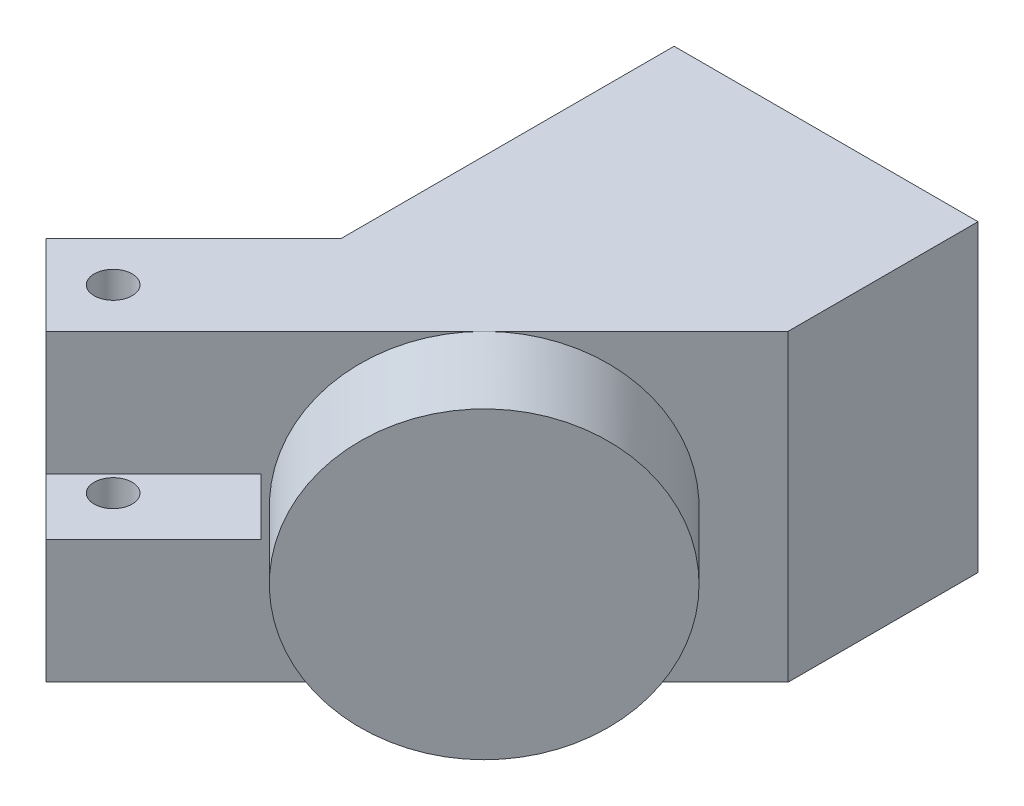
ISO-10303-21;
HEADER;
FILE_DESCRIPTION(('STEP AP214'),'2;1');
FILE_NAME('part.step','',(''),(''),'','','');
FILE_SCHEMA(('AUTOMOTIVE_DESIGN { 1 0 10303 214 1 1 1 1 }'));
ENDSEC;
DATA;
#1=APPLICATION_CONTEXT('core data for automotive mechanical design processes');
#2=APPLICATION_PROTOCOL_DEFINITION('international standard','automotive_design',2000,#1);
#3=PRODUCT_CONTEXT('',#1,'mechanical');
#4=PRODUCT('Part','Part','',(#3));
#5=PRODUCT_RELATED_PRODUCT_CATEGORY('part','',(#4));
#6=PRODUCT_DEFINITION_FORMATION('','',#4);
#7=PRODUCT_DEFINITION_CONTEXT('part definition',#1,'design');
#8=PRODUCT_DEFINITION('design','',#6,#7);
#9=PRODUCT_DEFINITION_SHAPE('','',#8);
#10=(LENGTH_UNIT() NAMED_UNIT(*) SI_UNIT(.MILLI.,.METRE.));
#11=(NAMED_UNIT(*) PLANE_ANGLE_UNIT() SI_UNIT($,.RADIAN.));
#12=(NAMED_UNIT(*) SI_UNIT($,.STERADIAN.) SOLID_ANGLE_UNIT());
#13=UNCERTAINTY_MEASURE_WITH_UNIT(LENGTH_MEASURE(1.E-05),#10,'distance_accuracy_value','');
#14=(GEOMETRIC_REPRESENTATION_CONTEXT(3) GLOBAL_UNCERTAINTY_ASSIGNED_CONTEXT((#13)) GLOBAL_UNIT_ASSIGNED_CONTEXT((#10,
#11,#12)) REPRESENTATION_CONTEXT('',''));
#15=CARTESIAN_POINT('',(0.,0.,0.));
#16=DIRECTION('',(0.,0.,1.));
#17=DIRECTION('',(1.,0.,0.));
#18=AXIS2_PLACEMENT_3D('',#15,#16,#17);
#19=CARTESIAN_POINT('',(-3.53553390593274,0.,29.5355339059327));
#20=DIRECTION('',(-0.707106781186547,0.,0.707106781186547));
#21=DIRECTION('',(0.707106781186548,0.,0.707106781186548));
#22=AXIS2_PLACEMENT_3D('',#19,#20,#21);
#23=PLANE('',#22);
#24=DIRECTION('',(0.707106781186547,0.,0.707106781186547));
#25=VECTOR('',#24,1.);
#26=CARTESIAN_POINT('',(-3.53553390593275,6.5,29.5355339059327));
#27=LINE('',#26,#25);
#28=CARTESIAN_POINT('',(-7.77817459305203,6.5,25.2928932188135));
#29=VERTEX_POINT('',#28);
#30=CARTESIAN_POINT('',(-3.53553390593275,6.5,29.5355339059327));
#31=VERTEX_POINT('',#30);
#32=EDGE_CURVE('E169',#29,#31,#27,.T.);
#33=ORIENTED_EDGE('',*,*,#32,.F.);
#34=DIRECTION('',(0.,1.,0.));
#35=VECTOR('',#34,1.);
#36=CARTESIAN_POINT('',(-7.77817459305202,0.,25.2928932188135));
#37=LINE('',#36,#35);
#38=CARTESIAN_POINT('',(-7.77817459305202,0.,25.2928932188135));
#39=VERTEX_POINT('',#38);
#40=EDGE_CURVE('E204',#39,#29,#37,.T.);
#41=ORIENTED_EDGE('',*,*,#40,.F.);
#42=DIRECTION('',(0.707106781186547,0.,0.707106781186547));
#43=VECTOR('',#42,1.);
#44=CARTESIAN_POINT('',(-3.53553390593274,0.,29.5355339059327));
#45=LINE('',#44,#43);
#46=CARTESIAN_POINT('',(-3.53553390593274,0.,29.5355339059327));
#47=VERTEX_POINT('',#46);
#48=EDGE_CURVE('E188',#39,#47,#45,.T.);
#49=ORIENTED_EDGE('',*,*,#48,.T.);
#50=DIRECTION('',(0.,1.,0.));
#51=VECTOR('',#50,1.);
#52=CARTESIAN_POINT('',(-3.53553390593274,0.,29.5355339059327));
#53=LINE('',#52,#51);
#54=EDGE_CURVE('E200',#47,#31,#53,.T.);
#55=ORIENTED_EDGE('',*,*,#54,.T.);
#56=EDGE_LOOP('',(#33,#41,#49,#55));
#57=FACE_BOUND('',#56,.T.);
#58=ADVANCED_FACE('F41',(#57),#23,.T.);
#59=CARTESIAN_POINT('',(0.,16.,26.));
#60=DIRECTION('',(0.707106781186548,0.,0.707106781186548));
#61=DIRECTION('',(0.707106781186548,0.,-0.707106781186548));
#62=AXIS2_PLACEMENT_3D('',#59,#60,#61);
#63=PLANE('',#62);
#64=DIRECTION('',(-0.707106781186548,0.,0.707106781186547));
#65=VECTOR('',#64,1.);
#66=CARTESIAN_POINT('',(2.12132034355963,6.5,23.8786796564404));
#67=LINE('',#66,#65);
#68=CARTESIAN_POINT('',(2.12132034355963,6.5,23.8786796564404));
#69=VERTEX_POINT('',#68);
#70=EDGE_CURVE('E196',#69,#31,#67,.T.);
#71=ORIENTED_EDGE('',*,*,#70,.T.);
#72=ORIENTED_EDGE('',*,*,#54,.F.);
#73=DIRECTION('',(-0.707106781186548,0.,0.707106781186548));
#74=VECTOR('',#73,1.);
#75=CARTESIAN_POINT('',(0.,0.,26.));
#76=LINE('',#75,#74);
#77=CARTESIAN_POINT('',(8.00000000000001,0.,18.));
#78=VERTEX_POINT('',#77);
#79=EDGE_CURVE('E214',#78,#47,#76,.T.);
#80=ORIENTED_EDGE('',*,*,#79,.F.);
#81=CARTESIAN_POINT('',(8.00000000000001,8.,18.));
#82=DIRECTION('',(0.707106781186548,0.,0.707106781186547));
#83=DIRECTION('',(0.707106781186547,0.,-0.707106781186548));
#84=AXIS2_PLACEMENT_3D('',#81,#82,#83);
#85=CIRCLE('',#84,8.);
#86=CARTESIAN_POINT('',(8.00000000000001,16.,18.));
#87=VERTEX_POINT('',#86);
#88=EDGE_CURVE('E53',#87,#78,#85,.T.);
#89=ORIENTED_EDGE('',*,*,#88,.F.);
#90=DIRECTION('',(-0.707106781186548,0.,0.707106781186548));
#91=VECTOR('',#90,1.);
#92=CARTESIAN_POINT('',(0.,16.,26.));
#93=LINE('',#92,#91);
#94=CARTESIAN_POINT('',(-3.53553390593274,16.,29.5355339059327));
#95=VERTEX_POINT('',#94);
#96=EDGE_CURVE('E222',#87,#95,#93,.T.);
#97=ORIENTED_EDGE('',*,*,#96,.T.);
#98=CARTESIAN_POINT('',(-3.53553390593275,9.5,29.5355339059327));
#99=VERTEX_POINT('',#98);
#100=EDGE_CURVE('E174',#99,#95,#53,.T.);
#101=ORIENTED_EDGE('',*,*,#100,.F.);
#102=DIRECTION('',(-0.707106781186548,0.,0.707106781186547));
#103=VECTOR('',#102,1.);
#104=CARTESIAN_POINT('',(2.12132034355963,9.5,23.8786796564404));
#105=LINE('',#104,#103);
#106=CARTESIAN_POINT('',(2.12132034355963,9.5,23.8786796564404));
#107=VERTEX_POINT('',#106);
#108=EDGE_CURVE('E152',#107,#99,#105,.T.);
#109=ORIENTED_EDGE('',*,*,#108,.F.);
#110=DIRECTION('',(0.,1.,0.));
#111=VECTOR('',#110,1.);
#112=CARTESIAN_POINT('',(2.12132034355963,9.5,23.8786796564404));
#113=LINE('',#112,#111);
#114=EDGE_CURVE('E159',#69,#107,#113,.T.);
#115=ORIENTED_EDGE('',*,*,#114,.F.);
#116=EDGE_LOOP('',(#71,#72,#80,#89,#97,#101,#109,#115));
#117=FACE_BOUND('',#116,.T.);
#118=ADVANCED_FACE('F172',(#117),#63,.T.);
#119=CARTESIAN_POINT('',(0.,0.,0.));
#120=DIRECTION('',(0.,0.,-1.));
#121=DIRECTION('',(-1.,0.,0.));
#122=AXIS2_PLACEMENT_3D('',#119,#120,#121);
#123=PLANE('',#122);
#124=DIRECTION('',(0.,-1.,0.));
#125=VECTOR('',#124,1.);
#126=CARTESIAN_POINT('',(0.,0.,0.));
#127=LINE('',#126,#125);
#128=CARTESIAN_POINT('',(0.,16.,0.));
#129=VERTEX_POINT('',#128);
#130=CARTESIAN_POINT('',(0.,0.,0.));
#131=VERTEX_POINT('',#130);
#132=EDGE_CURVE('E272',#129,#131,#127,.T.);
#133=ORIENTED_EDGE('',*,*,#132,.F.);
#134=DIRECTION('',(-1.,0.,0.));
#135=VECTOR('',#134,1.);
#136=CARTESIAN_POINT('',(0.,16.,0.));
#137=LINE('',#136,#135);
#138=CARTESIAN_POINT('',(16.,16.,0.));
#139=VERTEX_POINT('',#138);
#140=EDGE_CURVE('E278',#139,#129,#137,.T.);
#141=ORIENTED_EDGE('',*,*,#140,.F.);
#142=DIRECTION('',(0.,1.,0.));
#143=VECTOR('',#142,1.);
#144=CARTESIAN_POINT('',(16.,0.,0.));
#145=LINE('',#144,#143);
#146=CARTESIAN_POINT('',(16.,0.,0.));
#147=VERTEX_POINT('',#146);
#148=EDGE_CURVE('E285',#147,#139,#145,.T.);
#149=ORIENTED_EDGE('',*,*,#148,.F.);
#150=DIRECTION('',(1.,0.,0.));
#151=VECTOR('',#150,1.);
#152=CARTESIAN_POINT('',(0.,0.,0.));
#153=LINE('',#152,#151);
#154=EDGE_CURVE('E282',#131,#147,#153,.T.);
#155=ORIENTED_EDGE('',*,*,#154,.F.);
#156=EDGE_LOOP('',(#133,#141,#149,#155));
#157=FACE_BOUND('',#156,.T.);
#158=DIRECTION('',(-1.,0.,0.));
#159=VECTOR('',#158,1.);
#160=CARTESIAN_POINT('',(3.,13.,0.));
#161=LINE('',#160,#159);
#162=CARTESIAN_POINT('',(13.,13.,0.));
#163=VERTEX_POINT('',#162);
#164=CARTESIAN_POINT('',(3.,13.,0.));
#165=VERTEX_POINT('',#164);
#166=EDGE_CURVE('E232',#163,#165,#161,.T.);
#167=ORIENTED_EDGE('',*,*,#166,.T.);
#168=DIRECTION('',(0.,-1.,0.));
#169=VECTOR('',#168,1.);
#170=CARTESIAN_POINT('',(3.,3.,0.));
#171=LINE('',#170,#169);
#172=CARTESIAN_POINT('',(3.,3.,0.));
#173=VERTEX_POINT('',#172);
#174=EDGE_CURVE('E221',#165,#173,#171,.T.);
#175=ORIENTED_EDGE('',*,*,#174,.T.);
#176=DIRECTION('',(1.,0.,0.));
#177=VECTOR('',#176,1.);
#178=CARTESIAN_POINT('',(3.,3.,0.));
#179=LINE('',#178,#177);
#180=CARTESIAN_POINT('',(13.,3.,0.));
#181=VERTEX_POINT('',#180);
#182=EDGE_CURVE('E248',#173,#181,#179,.T.);
#183=ORIENTED_EDGE('',*,*,#182,.T.);
#184=DIRECTION('',(0.,1.,0.));
#185=VECTOR('',#184,1.);
#186=CARTESIAN_POINT('',(13.,3.,0.));
#187=LINE('',#186,#185);
#188=EDGE_CURVE('E252',#181,#163,#187,.T.);
#189=ORIENTED_EDGE('',*,*,#188,.T.);
#190=EDGE_LOOP('',(#167,#175,#183,#189));
#191=FACE_BOUND('',#190,.T.);
#192=ADVANCED_FACE('F311',(#157,#191),#123,.T.);
#193=CARTESIAN_POINT('',(0.,0.,10.));
#194=DIRECTION('',(1.,0.,0.));
#195=DIRECTION('',(0.,0.,-1.));
#196=AXIS2_PLACEMENT_3D('',#193,#194,#195);
#197=PLANE('',#196);
#198=DIRECTION('',(0.,0.,-1.));
#199=VECTOR('',#198,1.);
#200=CARTESIAN_POINT('',(0.,0.,10.));
#201=LINE('',#200,#199);
#202=CARTESIAN_POINT('',(0.,0.,17.5147186257614));
#203=VERTEX_POINT('',#202);
#204=EDGE_CURVE('E51',#203,#131,#201,.T.);
#205=ORIENTED_EDGE('',*,*,#204,.F.);
#206=DIRECTION('',(0.,1.,0.));
#207=VECTOR('',#206,1.);
#208=CARTESIAN_POINT('',(0.,0.,17.5147186257614));
#209=LINE('',#208,#207);
#210=CARTESIAN_POINT('',(0.,16.,17.5147186257614));
#211=VERTEX_POINT('',#210);
#212=EDGE_CURVE('E193',#203,#211,#209,.T.);
#213=ORIENTED_EDGE('',*,*,#212,.T.);
#214=DIRECTION('',(0.,0.,-1.));
#215=VECTOR('',#214,1.);
#216=CARTESIAN_POINT('',(0.,16.,10.));
#217=LINE('',#216,#215);
#218=EDGE_CURVE('E277',#211,#129,#217,.T.);
#219=ORIENTED_EDGE('',*,*,#218,.T.);
#220=ORIENTED_EDGE('',*,*,#132,.T.);
#221=EDGE_LOOP('',(#205,#213,#219,#220));
#222=FACE_BOUND('',#221,.T.);
#223=ADVANCED_FACE('F43',(#222),#197,.F.);
#224=CARTESIAN_POINT('',(0.,0.,10.));
#225=DIRECTION('',(0.,1.,0.));
#226=DIRECTION('',(0.,0.,1.));
#227=AXIS2_PLACEMENT_3D('',#224,#225,#226);
#228=PLANE('',#227);
#229=CARTESIAN_POINT('',(-3.88908729652601,0.,25.6464466094067));
#230=DIRECTION('',(0.,1.,0.));
#231=DIRECTION('',(0.,0.,1.));
#232=AXIS2_PLACEMENT_3D('',#229,#230,#231);
#233=CIRCLE('',#232,1.);
#234=CARTESIAN_POINT('',(-3.88908729652601,0.,26.6464466094067));
#235=VERTEX_POINT('',#234);
#236=EDGE_CURVE('E356',#235,#235,#233,.T.);
#237=ORIENTED_EDGE('',*,*,#236,.T.);
#238=EDGE_LOOP('',(#237));
#239=FACE_BOUND('',#238,.T.);
#240=ORIENTED_EDGE('',*,*,#154,.T.);
#241=DIRECTION('',(0.,0.,-1.));
#242=VECTOR('',#241,1.);
#243=CARTESIAN_POINT('',(16.,0.,10.));
#244=LINE('',#243,#242);
#245=CARTESIAN_POINT('',(16.,0.,10.));
#246=VERTEX_POINT('',#245);
#247=EDGE_CURVE('E297',#246,#147,#244,.T.);
#248=ORIENTED_EDGE('',*,*,#247,.F.);
#249=EDGE_CURVE('E223',#246,#78,#76,.T.);
#250=ORIENTED_EDGE('',*,*,#249,.T.);
#251=ORIENTED_EDGE('',*,*,#79,.T.);
#252=ORIENTED_EDGE('',*,*,#48,.F.);
#253=DIRECTION('',(-0.707106781186548,0.,0.707106781186548));
#254=VECTOR('',#253,1.);
#255=CARTESIAN_POINT('',(-7.77817459305202,0.,25.2928932188135));
#256=LINE('',#255,#254);
#257=EDGE_CURVE('E184',#203,#39,#256,.T.);
#258=ORIENTED_EDGE('',*,*,#257,.F.);
#259=ORIENTED_EDGE('',*,*,#204,.T.);
#260=EDGE_LOOP('',(#240,#248,#250,#251,#252,#258,#259));
#261=FACE_BOUND('',#260,.T.);
#262=ADVANCED_FACE('F305',(#239,#261),#228,.F.);
#263=CARTESIAN_POINT('',(16.,0.,10.));
#264=DIRECTION('',(-1.,0.,0.));
#265=DIRECTION('',(0.,0.,1.));
#266=AXIS2_PLACEMENT_3D('',#263,#264,#265);
#267=PLANE('',#266);
#268=ORIENTED_EDGE('',*,*,#148,.T.);
#269=DIRECTION('',(0.,0.,-1.));
#270=VECTOR('',#269,1.);
#271=CARTESIAN_POINT('',(16.,16.,10.));
#272=LINE('',#271,#270);
#273=CARTESIAN_POINT('',(16.,16.,10.));
#274=VERTEX_POINT('',#273);
#275=EDGE_CURVE('E293',#274,#139,#272,.T.);
#276=ORIENTED_EDGE('',*,*,#275,.F.);
#277=DIRECTION('',(0.,1.,0.));
#278=VECTOR('',#277,1.);
#279=CARTESIAN_POINT('',(16.,0.,10.));
#280=LINE('',#279,#278);
#281=EDGE_CURVE('E273',#246,#274,#280,.T.);
#282=ORIENTED_EDGE('',*,*,#281,.F.);
#283=ORIENTED_EDGE('',*,*,#247,.T.);
#284=EDGE_LOOP('',(#268,#276,#282,#283));
#285=FACE_BOUND('',#284,.T.);
#286=ADVANCED_FACE('F321',(#285),#267,.F.);
#287=CARTESIAN_POINT('',(0.,16.,10.));
#288=DIRECTION('',(0.,-1.,0.));
#289=DIRECTION('',(0.,0.,-1.));
#290=AXIS2_PLACEMENT_3D('',#287,#288,#289);
#291=PLANE('',#290);
#292=CARTESIAN_POINT('',(-3.88908729652601,16.,25.6464466094067));
#293=DIRECTION('',(0.,1.,0.));
#294=DIRECTION('',(0.,0.,1.));
#295=AXIS2_PLACEMENT_3D('',#292,#293,#294);
#296=CIRCLE('',#295,1.);
#297=CARTESIAN_POINT('',(-3.88908729652601,16.,26.6464466094067));
#298=VERTEX_POINT('',#297);
#299=EDGE_CURVE('E352',#298,#298,#296,.T.);
#300=ORIENTED_EDGE('',*,*,#299,.F.);
#301=EDGE_LOOP('',(#300));
#302=FACE_BOUND('',#301,.T.);
#303=ORIENTED_EDGE('',*,*,#140,.T.);
#304=ORIENTED_EDGE('',*,*,#218,.F.);
#305=DIRECTION('',(-0.707106781186548,0.,0.707106781186548));
#306=VECTOR('',#305,1.);
#307=CARTESIAN_POINT('',(-7.77817459305202,16.,25.2928932188135));
#308=LINE('',#307,#306);
#309=CARTESIAN_POINT('',(-7.77817459305202,16.,25.2928932188135));
#310=VERTEX_POINT('',#309);
#311=EDGE_CURVE('E68',#211,#310,#308,.T.);
#312=ORIENTED_EDGE('',*,*,#311,.T.);
#313=DIRECTION('',(0.707106781186547,0.,0.707106781186547));
#314=VECTOR('',#313,1.);
#315=CARTESIAN_POINT('',(-3.53553390593274,16.,29.5355339059327));
#316=LINE('',#315,#314);
#317=EDGE_CURVE('E189',#310,#95,#316,.T.);
#318=ORIENTED_EDGE('',*,*,#317,.T.);
#319=ORIENTED_EDGE('',*,*,#96,.F.);
#320=EDGE_CURVE('E218',#274,#87,#93,.T.);
#321=ORIENTED_EDGE('',*,*,#320,.F.);
#322=ORIENTED_EDGE('',*,*,#275,.T.);
#323=EDGE_LOOP('',(#303,#304,#312,#318,#319,#321,#322));
#324=FACE_BOUND('',#323,.T.);
#325=ADVANCED_FACE('F316',(#302,#324),#291,.F.);
#326=CARTESIAN_POINT('',(3.,3.,10.));
#327=DIRECTION('',(1.,0.,0.));
#328=DIRECTION('',(0.,0.,-1.));
#329=AXIS2_PLACEMENT_3D('',#326,#327,#328);
#330=PLANE('',#329);
#331=ORIENTED_EDGE('',*,*,#174,.F.);
#332=DIRECTION('',(0.,0.,-1.));
#333=VECTOR('',#332,1.);
#334=CARTESIAN_POINT('',(3.,13.,10.));
#335=LINE('',#334,#333);
#336=CARTESIAN_POINT('',(3.,13.,10.));
#337=VERTEX_POINT('',#336);
#338=EDGE_CURVE('E244',#337,#165,#335,.T.);
#339=ORIENTED_EDGE('',*,*,#338,.F.);
#340=DIRECTION('',(0.,-1.,0.));
#341=VECTOR('',#340,1.);
#342=CARTESIAN_POINT('',(3.,3.,10.));
#343=LINE('',#342,#341);
#344=CARTESIAN_POINT('',(3.,3.,10.));
#345=VERTEX_POINT('',#344);
#346=EDGE_CURVE('E227',#337,#345,#343,.T.);
#347=ORIENTED_EDGE('',*,*,#346,.T.);
#348=DIRECTION('',(0.,0.,-1.));
#349=VECTOR('',#348,1.);
#350=CARTESIAN_POINT('',(3.,3.,10.));
#351=LINE('',#350,#349);
#352=EDGE_CURVE('E268',#345,#173,#351,.T.);
#353=ORIENTED_EDGE('',*,*,#352,.T.);
#354=EDGE_LOOP('',(#331,#339,#347,#353));
#355=FACE_BOUND('',#354,.T.);
#356=ADVANCED_FACE('F437',(#355),#330,.T.);
#357=CARTESIAN_POINT('',(3.,3.,10.));
#358=DIRECTION('',(0.,1.,0.));
#359=DIRECTION('',(0.,0.,1.));
#360=AXIS2_PLACEMENT_3D('',#357,#358,#359);
#361=PLANE('',#360);
#362=ORIENTED_EDGE('',*,*,#182,.F.);
#363=ORIENTED_EDGE('',*,*,#352,.F.);
#364=DIRECTION('',(1.,0.,0.));
#365=VECTOR('',#364,1.);
#366=CARTESIAN_POINT('',(3.,3.,10.));
#367=LINE('',#366,#365);
#368=CARTESIAN_POINT('',(13.,3.,10.));
#369=VERTEX_POINT('',#368);
#370=EDGE_CURVE('E231',#345,#369,#367,.T.);
#371=ORIENTED_EDGE('',*,*,#370,.T.);
#372=DIRECTION('',(0.,0.,-1.));
#373=VECTOR('',#372,1.);
#374=CARTESIAN_POINT('',(13.,3.,10.));
#375=LINE('',#374,#373);
#376=EDGE_CURVE('E265',#369,#181,#375,.T.);
#377=ORIENTED_EDGE('',*,*,#376,.T.);
#378=EDGE_LOOP('',(#362,#363,#371,#377));
#379=FACE_BOUND('',#378,.T.);
#380=ADVANCED_FACE('F530',(#379),#361,.T.);
#381=CARTESIAN_POINT('',(13.,3.,10.));
#382=DIRECTION('',(-1.,0.,0.));
#383=DIRECTION('',(0.,-1.,0.));
#384=AXIS2_PLACEMENT_3D('',#381,#382,#383);
#385=PLANE('',#384);
#386=ORIENTED_EDGE('',*,*,#188,.F.);
#387=ORIENTED_EDGE('',*,*,#376,.F.);
#388=DIRECTION('',(0.,1.,0.));
#389=VECTOR('',#388,1.);
#390=CARTESIAN_POINT('',(13.,3.,10.));
#391=LINE('',#390,#389);
#392=CARTESIAN_POINT('',(13.,13.,10.));
#393=VERTEX_POINT('',#392);
#394=EDGE_CURVE('E236',#369,#393,#391,.T.);
#395=ORIENTED_EDGE('',*,*,#394,.T.);
#396=DIRECTION('',(0.,0.,-1.));
#397=VECTOR('',#396,1.);
#398=CARTESIAN_POINT('',(13.,13.,10.));
#399=LINE('',#398,#397);
#400=EDGE_CURVE('E262',#393,#163,#399,.T.);
#401=ORIENTED_EDGE('',*,*,#400,.T.);
#402=EDGE_LOOP('',(#386,#387,#395,#401));
#403=FACE_BOUND('',#402,.T.);
#404=ADVANCED_FACE('F520',(#403),#385,.T.);
#405=CARTESIAN_POINT('',(3.,13.,10.));
#406=DIRECTION('',(0.,-1.,0.));
#407=DIRECTION('',(0.,0.,-1.));
#408=AXIS2_PLACEMENT_3D('',#405,#406,#407);
#409=PLANE('',#408);
#410=ORIENTED_EDGE('',*,*,#166,.F.);
#411=ORIENTED_EDGE('',*,*,#400,.F.);
#412=DIRECTION('',(-1.,0.,0.));
#413=VECTOR('',#412,1.);
#414=CARTESIAN_POINT('',(3.,13.,10.));
#415=LINE('',#414,#413);
#416=EDGE_CURVE('E240',#393,#337,#415,.T.);
#417=ORIENTED_EDGE('',*,*,#416,.T.);
#418=ORIENTED_EDGE('',*,*,#338,.T.);
#419=EDGE_LOOP('',(#410,#411,#417,#418));
#420=FACE_BOUND('',#419,.T.);
#421=ADVANCED_FACE('F511',(#420),#409,.T.);
#422=CARTESIAN_POINT('',(16.,16.,10.));
#423=DIRECTION('',(0.,0.,-1.));
#424=DIRECTION('',(-1.,0.,0.));
#425=AXIS2_PLACEMENT_3D('',#422,#423,#424);
#426=PLANE('',#425);
#427=ORIENTED_EDGE('',*,*,#346,.F.);
#428=ORIENTED_EDGE('',*,*,#416,.F.);
#429=ORIENTED_EDGE('',*,*,#394,.F.);
#430=ORIENTED_EDGE('',*,*,#370,.F.);
#431=EDGE_LOOP('',(#427,#428,#429,#430));
#432=FACE_BOUND('',#431,.T.);
#433=ADVANCED_FACE('F503',(#432),#426,.T.);
#434=EDGE_CURVE('E11',#78,#87,#85,.T.);
#435=ORIENTED_EDGE('',*,*,#434,.F.);
#436=ORIENTED_EDGE('',*,*,#249,.F.);
#437=ORIENTED_EDGE('',*,*,#281,.T.);
#438=ORIENTED_EDGE('',*,*,#320,.T.);
#439=EDGE_LOOP('',(#435,#436,#437,#438));
#440=FACE_BOUND('',#439,.T.);
#441=ADVANCED_FACE('F324',(#440),#63,.T.);
#442=CARTESIAN_POINT('',(11.5355339059327,8.,21.5355339059327));
#443=DIRECTION('',(-0.707106781186548,0.,-0.707106781186547));
#444=DIRECTION('',(-0.707106781186547,0.,0.707106781186548));
#445=AXIS2_PLACEMENT_3D('',#442,#443,#444);
#446=CYLINDRICAL_SURFACE('',#445,8.);
#447=CARTESIAN_POINT('',(11.5355339059327,8.,21.5355339059327));
#448=DIRECTION('',(0.707106781186548,0.,0.707106781186547));
#449=DIRECTION('',(0.707106781186547,0.,-0.707106781186548));
#450=AXIS2_PLACEMENT_3D('',#447,#448,#449);
#451=CIRCLE('',#450,8.);
#452=CARTESIAN_POINT('',(17.1923881554251,8.,15.8786796564404));
#453=VERTEX_POINT('',#452);
#454=EDGE_CURVE('E211',#453,#453,#451,.T.);
#455=ORIENTED_EDGE('',*,*,#454,.F.);
#456=EDGE_LOOP('',(#455));
#457=FACE_BOUND('',#456,.T.);
#458=ORIENTED_EDGE('',*,*,#88,.T.);
#459=ORIENTED_EDGE('',*,*,#434,.T.);
#460=EDGE_LOOP('',(#458,#459));
#461=FACE_BOUND('',#460,.T.);
#462=ADVANCED_FACE('F329',(#457,#461),#446,.T.);
#463=CARTESIAN_POINT('',(16.5355339059327,0.,16.5355339059327));
#464=DIRECTION('',(0.707106781186548,0.,0.707106781186547));
#465=DIRECTION('',(0.707106781186547,0.,-0.707106781186548));
#466=AXIS2_PLACEMENT_3D('',#463,#464,#465);
#467=PLANE('',#466);
#468=ORIENTED_EDGE('',*,*,#454,.T.);
#469=EDGE_LOOP('',(#468));
#470=FACE_BOUND('',#469,.T.);
#471=ADVANCED_FACE('F389',(#470),#467,.T.);
#472=DIRECTION('',(-0.707106781186547,0.,-0.707106781186547));
#473=VECTOR('',#472,1.);
#474=CARTESIAN_POINT('',(-3.53553390593275,9.5,29.5355339059327));
#475=LINE('',#474,#473);
#476=CARTESIAN_POINT('',(-7.77817459305203,9.5,25.2928932188135));
#477=VERTEX_POINT('',#476);
#478=EDGE_CURVE('E343',#99,#477,#475,.T.);
#479=ORIENTED_EDGE('',*,*,#478,.F.);
#480=ORIENTED_EDGE('',*,*,#100,.T.);
#481=ORIENTED_EDGE('',*,*,#317,.F.);
#482=EDGE_CURVE('E208',#477,#310,#37,.T.);
#483=ORIENTED_EDGE('',*,*,#482,.F.);
#484=EDGE_LOOP('',(#479,#480,#481,#483));
#485=FACE_BOUND('',#484,.T.);
#486=ADVANCED_FACE('F380',(#485),#23,.T.);
#487=CARTESIAN_POINT('',(-7.77817459305202,0.,25.2928932188135));
#488=DIRECTION('',(-0.707106781186548,0.,-0.707106781186548));
#489=DIRECTION('',(-0.707106781186548,0.,0.707106781186548));
#490=AXIS2_PLACEMENT_3D('',#487,#488,#489);
#491=PLANE('',#490);
#492=DIRECTION('',(-0.707106781186548,0.,0.707106781186547));
#493=VECTOR('',#492,1.);
#494=CARTESIAN_POINT('',(-2.12132034355964,6.5,19.6360389693211));
#495=LINE('',#494,#493);
#496=CARTESIAN_POINT('',(-2.12132034355964,6.5,19.6360389693211));
#497=VERTEX_POINT('',#496);
#498=EDGE_CURVE('E179',#497,#29,#495,.T.);
#499=ORIENTED_EDGE('',*,*,#498,.F.);
#500=DIRECTION('',(0.,-1.,0.));
#501=VECTOR('',#500,1.);
#502=CARTESIAN_POINT('',(-2.12132034355964,9.5,19.6360389693211));
#503=LINE('',#502,#501);
#504=CARTESIAN_POINT('',(-2.12132034355965,9.5,19.6360389693211));
#505=VERTEX_POINT('',#504);
#506=EDGE_CURVE('E158',#505,#497,#503,.T.);
#507=ORIENTED_EDGE('',*,*,#506,.F.);
#508=DIRECTION('',(-0.707106781186548,0.,0.707106781186547));
#509=VECTOR('',#508,1.);
#510=CARTESIAN_POINT('',(-2.12132034355964,9.5,19.6360389693211));
#511=LINE('',#510,#509);
#512=EDGE_CURVE('E155',#505,#477,#511,.T.);
#513=ORIENTED_EDGE('',*,*,#512,.T.);
#514=ORIENTED_EDGE('',*,*,#482,.T.);
#515=ORIENTED_EDGE('',*,*,#311,.F.);
#516=ORIENTED_EDGE('',*,*,#212,.F.);
#517=ORIENTED_EDGE('',*,*,#257,.T.);
#518=ORIENTED_EDGE('',*,*,#40,.T.);
#519=EDGE_LOOP('',(#499,#507,#513,#514,#515,#516,#517,#518));
#520=FACE_BOUND('',#519,.T.);
#521=ADVANCED_FACE('F388',(#520),#491,.T.);
#522=CARTESIAN_POINT('',(2.12132034355963,6.5,23.8786796564404));
#523=DIRECTION('',(0.,-1.,0.));
#524=DIRECTION('',(0.,0.,-1.));
#525=AXIS2_PLACEMENT_3D('',#522,#523,#524);
#526=PLANE('',#525);
#527=CARTESIAN_POINT('',(-3.88908729652601,6.5,25.6464466094067));
#528=DIRECTION('',(0.,-1.,0.));
#529=DIRECTION('',(0.,0.,-1.));
#530=AXIS2_PLACEMENT_3D('',#527,#528,#529);
#531=CIRCLE('',#530,1.);
#532=CARTESIAN_POINT('',(-3.88908729652601,6.5,24.6464466094067));
#533=VERTEX_POINT('',#532);
#534=EDGE_CURVE('E345',#533,#533,#531,.T.);
#535=ORIENTED_EDGE('',*,*,#534,.T.);
#536=EDGE_LOOP('',(#535));
#537=FACE_BOUND('',#536,.T.);
#538=ORIENTED_EDGE('',*,*,#32,.T.);
#539=ORIENTED_EDGE('',*,*,#70,.F.);
#540=DIRECTION('',(0.707106781186547,0.,0.707106781186547));
#541=VECTOR('',#540,1.);
#542=CARTESIAN_POINT('',(2.12132034355963,6.5,23.8786796564404));
#543=LINE('',#542,#541);
#544=EDGE_CURVE('E165',#497,#69,#543,.T.);
#545=ORIENTED_EDGE('',*,*,#544,.F.);
#546=ORIENTED_EDGE('',*,*,#498,.T.);
#547=EDGE_LOOP('',(#538,#539,#545,#546));
#548=FACE_BOUND('',#547,.T.);
#549=ADVANCED_FACE('F395',(#537,#548),#526,.F.);
#550=CARTESIAN_POINT('',(2.12132034355963,9.5,23.8786796564404));
#551=DIRECTION('',(0.,1.,0.));
#552=DIRECTION('',(0.,0.,1.));
#553=AXIS2_PLACEMENT_3D('',#550,#551,#552);
#554=PLANE('',#553);
#555=CARTESIAN_POINT('',(-3.88908729652601,9.5,25.6464466094067));
#556=DIRECTION('',(0.,1.,0.));
#557=DIRECTION('',(0.,0.,1.));
#558=AXIS2_PLACEMENT_3D('',#555,#556,#557);
#559=CIRCLE('',#558,1.);
#560=CARTESIAN_POINT('',(-3.88908729652601,9.5,26.6464466094067));
#561=VERTEX_POINT('',#560);
#562=EDGE_CURVE('E45',#561,#561,#559,.T.);
#563=ORIENTED_EDGE('',*,*,#562,.T.);
#564=EDGE_LOOP('',(#563));
#565=FACE_BOUND('',#564,.T.);
#566=ORIENTED_EDGE('',*,*,#478,.T.);
#567=ORIENTED_EDGE('',*,*,#512,.F.);
#568=DIRECTION('',(-0.707106781186547,0.,-0.707106781186547));
#569=VECTOR('',#568,1.);
#570=CARTESIAN_POINT('',(2.12132034355963,9.5,23.8786796564404));
#571=LINE('',#570,#569);
#572=EDGE_CURVE('E60',#107,#505,#571,.T.);
#573=ORIENTED_EDGE('',*,*,#572,.F.);
#574=ORIENTED_EDGE('',*,*,#108,.T.);
#575=EDGE_LOOP('',(#566,#567,#573,#574));
#576=FACE_BOUND('',#575,.T.);
#577=ADVANCED_FACE('F150',(#565,#576),#554,.F.);
#578=CARTESIAN_POINT('',(-10.8786796564404,0.,10.8786796564404));
#579=DIRECTION('',(0.707106781186548,0.,-0.707106781186548));
#580=DIRECTION('',(-0.707106781186548,0.,-0.707106781186548));
#581=AXIS2_PLACEMENT_3D('',#578,#579,#580);
#582=PLANE('',#581);
#583=ORIENTED_EDGE('',*,*,#114,.T.);
#584=ORIENTED_EDGE('',*,*,#572,.T.);
#585=ORIENTED_EDGE('',*,*,#506,.T.);
#586=ORIENTED_EDGE('',*,*,#544,.T.);
#587=EDGE_LOOP('',(#583,#584,#585,#586));
#588=FACE_BOUND('',#587,.T.);
#589=ADVANCED_FACE('F163',(#588),#582,.F.);
#590=CARTESIAN_POINT('',(-3.88908729652601,0.,25.6464466094067));
#591=DIRECTION('',(0.,1.,0.));
#592=DIRECTION('',(0.,0.,1.));
#593=AXIS2_PLACEMENT_3D('',#590,#591,#592);
#594=CYLINDRICAL_SURFACE('',#593,1.);
#595=ORIENTED_EDGE('',*,*,#299,.T.);
#596=EDGE_LOOP('',(#595));
#597=FACE_BOUND('',#596,.T.);
#598=ORIENTED_EDGE('',*,*,#562,.F.);
#599=EDGE_LOOP('',(#598));
#600=FACE_BOUND('',#599,.T.);
#601=ADVANCED_FACE('F366',(#597,#600),#594,.F.);
#602=ORIENTED_EDGE('',*,*,#236,.F.);
#603=EDGE_LOOP('',(#602));
#604=FACE_BOUND('',#603,.T.);
#605=ORIENTED_EDGE('',*,*,#534,.F.);
#606=EDGE_LOOP('',(#605));
#607=FACE_BOUND('',#606,.T.);
#608=ADVANCED_FACE('F368',(#604,#607),#594,.F.);
#609=CLOSED_SHELL('',(#58,#118,#192,#223,#262,#286,#325,#356,#380,#404,#421,#433,#441,#462,#471,
#486,#521,#549,#577,#589,#601,#608));
#610=MANIFOLD_SOLID_BREP('B2',#609);
#611=ADVANCED_BREP_SHAPE_REPRESENTATION('',(#18,#610),#14);
#612=SHAPE_DEFINITION_REPRESENTATION(#9,#611);
ENDSEC;
END-ISO-10303-21;
